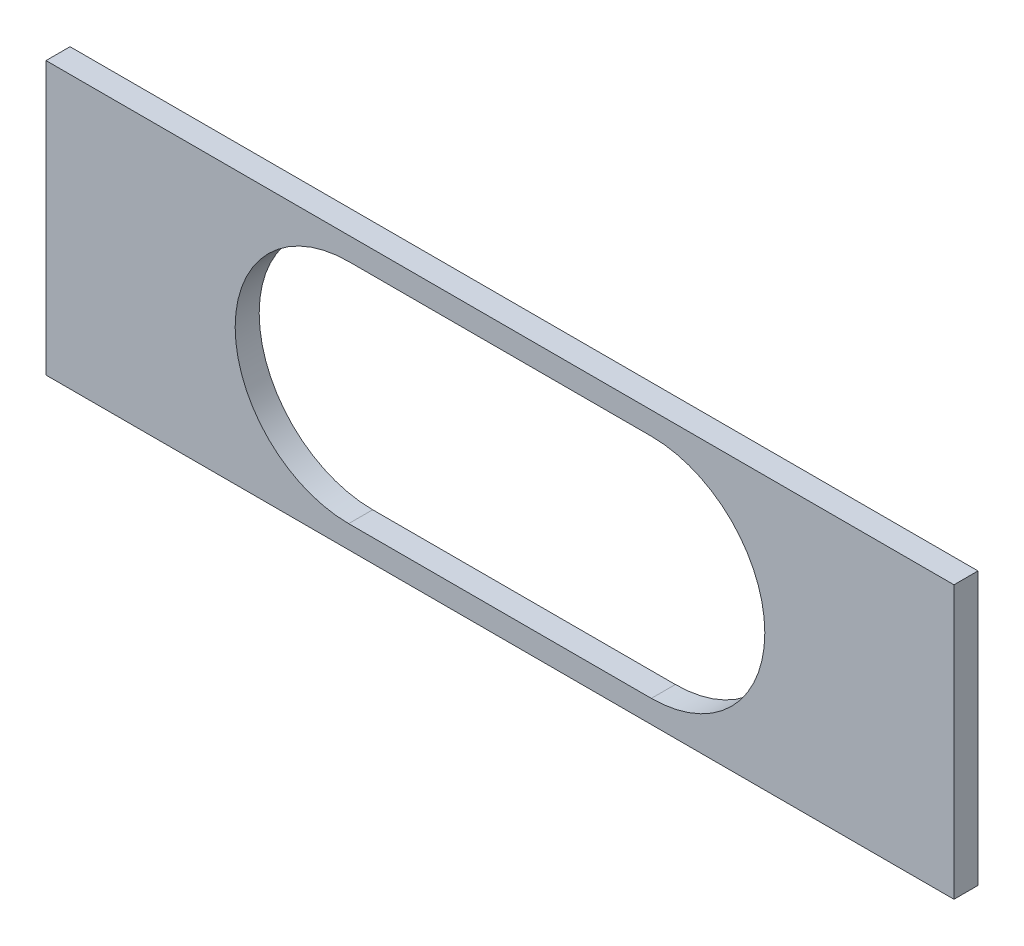
ISO-10303-21;
HEADER;
FILE_DESCRIPTION(('STEP AP214'),'2;1');
FILE_NAME('part.step','',(''),(''),'','','');
FILE_SCHEMA(('AUTOMOTIVE_DESIGN { 1 0 10303 214 1 1 1 1 }'));
ENDSEC;
DATA;
#1=APPLICATION_CONTEXT('core data for automotive mechanical design processes');
#2=APPLICATION_PROTOCOL_DEFINITION('international standard','automotive_design',2000,#1);
#3=PRODUCT_CONTEXT('',#1,'mechanical');
#4=PRODUCT('Part','Part','',(#3));
#5=PRODUCT_RELATED_PRODUCT_CATEGORY('part','',(#4));
#6=PRODUCT_DEFINITION_FORMATION('','',#4);
#7=PRODUCT_DEFINITION_CONTEXT('part definition',#1,'design');
#8=PRODUCT_DEFINITION('design','',#6,#7);
#9=PRODUCT_DEFINITION_SHAPE('','',#8);
#10=(LENGTH_UNIT() NAMED_UNIT(*) SI_UNIT(.MILLI.,.METRE.));
#11=(NAMED_UNIT(*) PLANE_ANGLE_UNIT() SI_UNIT($,.RADIAN.));
#12=(NAMED_UNIT(*) SI_UNIT($,.STERADIAN.) SOLID_ANGLE_UNIT());
#13=UNCERTAINTY_MEASURE_WITH_UNIT(LENGTH_MEASURE(1.E-05),#10,'distance_accuracy_value','');
#14=(GEOMETRIC_REPRESENTATION_CONTEXT(3) GLOBAL_UNCERTAINTY_ASSIGNED_CONTEXT((#13)) GLOBAL_UNIT_ASSIGNED_CONTEXT((#10,
#11,#12)) REPRESENTATION_CONTEXT('',''));
#15=CARTESIAN_POINT('',(0.,0.,0.));
#16=DIRECTION('',(0.,0.,1.));
#17=DIRECTION('',(1.,0.,0.));
#18=AXIS2_PLACEMENT_3D('',#15,#16,#17);
#19=CARTESIAN_POINT('',(-60.,-18.,3.175));
#20=DIRECTION('',(1.,0.,0.));
#21=DIRECTION('',(0.,0.,-1.));
#22=AXIS2_PLACEMENT_3D('',#19,#20,#21);
#23=PLANE('',#22);
#24=DIRECTION('',(0.,-1.,0.));
#25=VECTOR('',#24,1.);
#26=CARTESIAN_POINT('',(-60.,-18.,0.));
#27=LINE('',#26,#25);
#28=CARTESIAN_POINT('',(-60.,18.,0.));
#29=VERTEX_POINT('',#28);
#30=CARTESIAN_POINT('',(-60.,-18.,0.));
#31=VERTEX_POINT('',#30);
#32=EDGE_CURVE('E140',#29,#31,#27,.T.);
#33=ORIENTED_EDGE('',*,*,#32,.T.);
#34=DIRECTION('',(0.,0.,-1.));
#35=VECTOR('',#34,1.);
#36=CARTESIAN_POINT('',(-60.,-18.,3.175));
#37=LINE('',#36,#35);
#38=CARTESIAN_POINT('',(-60.,-18.,3.175));
#39=VERTEX_POINT('',#38);
#40=EDGE_CURVE('E11',#39,#31,#37,.T.);
#41=ORIENTED_EDGE('',*,*,#40,.F.);
#42=DIRECTION('',(0.,-1.,0.));
#43=VECTOR('',#42,1.);
#44=CARTESIAN_POINT('',(-60.,-18.,3.175));
#45=LINE('',#44,#43);
#46=CARTESIAN_POINT('',(-60.,18.,3.175));
#47=VERTEX_POINT('',#46);
#48=EDGE_CURVE('E144',#47,#39,#45,.T.);
#49=ORIENTED_EDGE('',*,*,#48,.F.);
#50=DIRECTION('',(0.,0.,-1.));
#51=VECTOR('',#50,1.);
#52=CARTESIAN_POINT('',(-60.,18.,3.175));
#53=LINE('',#52,#51);
#54=EDGE_CURVE('E154',#47,#29,#53,.T.);
#55=ORIENTED_EDGE('',*,*,#54,.T.);
#56=EDGE_LOOP('',(#33,#41,#49,#55));
#57=FACE_BOUND('',#56,.T.);
#58=ADVANCED_FACE('F39',(#57),#23,.F.);
#59=CARTESIAN_POINT('',(60.,-18.,3.175));
#60=DIRECTION('',(0.,1.,0.));
#61=DIRECTION('',(-1.,0.,0.));
#62=AXIS2_PLACEMENT_3D('',#59,#60,#61);
#63=PLANE('',#62);
#64=DIRECTION('',(1.,0.,0.));
#65=VECTOR('',#64,1.);
#66=CARTESIAN_POINT('',(60.,-18.,0.));
#67=LINE('',#66,#65);
#68=CARTESIAN_POINT('',(60.,-18.,0.));
#69=VERTEX_POINT('',#68);
#70=EDGE_CURVE('E157',#31,#69,#67,.T.);
#71=ORIENTED_EDGE('',*,*,#70,.T.);
#72=DIRECTION('',(0.,0.,-1.));
#73=VECTOR('',#72,1.);
#74=CARTESIAN_POINT('',(60.,-18.,3.175));
#75=LINE('',#74,#73);
#76=CARTESIAN_POINT('',(60.,-18.,3.175));
#77=VERTEX_POINT('',#76);
#78=EDGE_CURVE('E46',#77,#69,#75,.T.);
#79=ORIENTED_EDGE('',*,*,#78,.F.);
#80=DIRECTION('',(1.,0.,0.));
#81=VECTOR('',#80,1.);
#82=CARTESIAN_POINT('',(60.,-18.,3.175));
#83=LINE('',#82,#81);
#84=EDGE_CURVE('E147',#39,#77,#83,.T.);
#85=ORIENTED_EDGE('',*,*,#84,.F.);
#86=ORIENTED_EDGE('',*,*,#40,.T.);
#87=EDGE_LOOP('',(#71,#79,#85,#86));
#88=FACE_BOUND('',#87,.T.);
#89=ADVANCED_FACE('F185',(#88),#63,.F.);
#90=CARTESIAN_POINT('',(60.,-18.,3.175));
#91=DIRECTION('',(-1.,0.,0.));
#92=DIRECTION('',(0.,0.,1.));
#93=AXIS2_PLACEMENT_3D('',#90,#91,#92);
#94=PLANE('',#93);
#95=DIRECTION('',(0.,1.,0.));
#96=VECTOR('',#95,1.);
#97=CARTESIAN_POINT('',(60.,-18.,0.));
#98=LINE('',#97,#96);
#99=CARTESIAN_POINT('',(60.,18.,0.));
#100=VERTEX_POINT('',#99);
#101=EDGE_CURVE('E159',#69,#100,#98,.T.);
#102=ORIENTED_EDGE('',*,*,#101,.T.);
#103=DIRECTION('',(0.,0.,-1.));
#104=VECTOR('',#103,1.);
#105=CARTESIAN_POINT('',(60.,18.,3.175));
#106=LINE('',#105,#104);
#107=CARTESIAN_POINT('',(60.,18.,3.175));
#108=VERTEX_POINT('',#107);
#109=EDGE_CURVE('E164',#108,#100,#106,.T.);
#110=ORIENTED_EDGE('',*,*,#109,.F.);
#111=DIRECTION('',(0.,1.,0.));
#112=VECTOR('',#111,1.);
#113=CARTESIAN_POINT('',(60.,-18.,3.175));
#114=LINE('',#113,#112);
#115=EDGE_CURVE('E150',#77,#108,#114,.T.);
#116=ORIENTED_EDGE('',*,*,#115,.F.);
#117=ORIENTED_EDGE('',*,*,#78,.T.);
#118=EDGE_LOOP('',(#102,#110,#116,#117));
#119=FACE_BOUND('',#118,.T.);
#120=ADVANCED_FACE('F171',(#119),#94,.F.);
#121=CARTESIAN_POINT('',(60.,18.,3.175));
#122=DIRECTION('',(0.,-1.,0.));
#123=DIRECTION('',(1.,0.,0.));
#124=AXIS2_PLACEMENT_3D('',#121,#122,#123);
#125=PLANE('',#124);
#126=DIRECTION('',(-1.,0.,0.));
#127=VECTOR('',#126,1.);
#128=CARTESIAN_POINT('',(60.,18.,0.));
#129=LINE('',#128,#127);
#130=EDGE_CURVE('E148',#100,#29,#129,.T.);
#131=ORIENTED_EDGE('',*,*,#130,.T.);
#132=ORIENTED_EDGE('',*,*,#54,.F.);
#133=DIRECTION('',(-1.,0.,0.));
#134=VECTOR('',#133,1.);
#135=CARTESIAN_POINT('',(60.,18.,3.175));
#136=LINE('',#135,#134);
#137=EDGE_CURVE('E152',#108,#47,#136,.T.);
#138=ORIENTED_EDGE('',*,*,#137,.F.);
#139=ORIENTED_EDGE('',*,*,#109,.T.);
#140=EDGE_LOOP('',(#131,#132,#138,#139));
#141=FACE_BOUND('',#140,.T.);
#142=ADVANCED_FACE('F178',(#141),#125,.F.);
#143=CARTESIAN_POINT('',(0.,0.,3.175));
#144=DIRECTION('',(0.,0.,1.));
#145=DIRECTION('',(1.,0.,0.));
#146=AXIS2_PLACEMENT_3D('',#143,#144,#145);
#147=PLANE('',#146);
#148=CARTESIAN_POINT('',(20.,0.,3.175));
#149=DIRECTION('',(0.,0.,1.));
#150=DIRECTION('',(1.,0.,0.));
#151=AXIS2_PLACEMENT_3D('',#148,#149,#150);
#152=CIRCLE('',#151,15.);
#153=CARTESIAN_POINT('',(20.,-15.,3.175));
#154=VERTEX_POINT('',#153);
#155=CARTESIAN_POINT('',(20.,15.,3.175));
#156=VERTEX_POINT('',#155);
#157=EDGE_CURVE('E53',#154,#156,#152,.T.);
#158=ORIENTED_EDGE('',*,*,#157,.F.);
#159=DIRECTION('',(1.,0.,0.));
#160=VECTOR('',#159,1.);
#161=CARTESIAN_POINT('',(20.,-15.,3.175));
#162=LINE('',#161,#160);
#163=CARTESIAN_POINT('',(-20.,-15.,3.175));
#164=VERTEX_POINT('',#163);
#165=EDGE_CURVE('E121',#164,#154,#162,.T.);
#166=ORIENTED_EDGE('',*,*,#165,.F.);
#167=CARTESIAN_POINT('',(-20.,0.,3.175));
#168=DIRECTION('',(0.,0.,1.));
#169=DIRECTION('',(1.,0.,0.));
#170=AXIS2_PLACEMENT_3D('',#167,#168,#169);
#171=CIRCLE('',#170,15.);
#172=CARTESIAN_POINT('',(-20.,15.,3.175));
#173=VERTEX_POINT('',#172);
#174=EDGE_CURVE('E124',#173,#164,#171,.T.);
#175=ORIENTED_EDGE('',*,*,#174,.F.);
#176=DIRECTION('',(-1.,0.,0.));
#177=VECTOR('',#176,1.);
#178=CARTESIAN_POINT('',(20.,15.,3.175));
#179=LINE('',#178,#177);
#180=EDGE_CURVE('E133',#156,#173,#179,.T.);
#181=ORIENTED_EDGE('',*,*,#180,.F.);
#182=EDGE_LOOP('',(#158,#166,#175,#181));
#183=FACE_BOUND('',#182,.T.);
#184=ORIENTED_EDGE('',*,*,#48,.T.);
#185=ORIENTED_EDGE('',*,*,#84,.T.);
#186=ORIENTED_EDGE('',*,*,#115,.T.);
#187=ORIENTED_EDGE('',*,*,#137,.T.);
#188=EDGE_LOOP('',(#184,#185,#186,#187));
#189=FACE_BOUND('',#188,.T.);
#190=ADVANCED_FACE('F184',(#183,#189),#147,.T.);
#191=CARTESIAN_POINT('',(0.,0.,0.));
#192=DIRECTION('',(0.,0.,1.));
#193=DIRECTION('',(1.,0.,0.));
#194=AXIS2_PLACEMENT_3D('',#191,#192,#193);
#195=PLANE('',#194);
#196=CARTESIAN_POINT('',(-50.,10.,0.));
#197=DIRECTION('',(0.,0.,-1.));
#198=DIRECTION('',(-1.,0.,0.));
#199=AXIS2_PLACEMENT_3D('',#196,#197,#198);
#200=CIRCLE('',#199,0.999999999999998);
#201=CARTESIAN_POINT('',(-51.,10.,0.));
#202=VERTEX_POINT('',#201);
#203=EDGE_CURVE('E263',#202,#202,#200,.T.);
#204=ORIENTED_EDGE('',*,*,#203,.F.);
#205=EDGE_LOOP('',(#204));
#206=FACE_BOUND('',#205,.T.);
#207=CARTESIAN_POINT('',(-50.,-9.99999999999999,0.));
#208=DIRECTION('',(0.,0.,-1.));
#209=DIRECTION('',(-1.,0.,0.));
#210=AXIS2_PLACEMENT_3D('',#207,#208,#209);
#211=CIRCLE('',#210,0.999999999999998);
#212=CARTESIAN_POINT('',(-51.,-9.99999999999999,0.));
#213=VERTEX_POINT('',#212);
#214=EDGE_CURVE('E255',#213,#213,#211,.T.);
#215=ORIENTED_EDGE('',*,*,#214,.F.);
#216=EDGE_LOOP('',(#215));
#217=FACE_BOUND('',#216,.T.);
#218=CARTESIAN_POINT('',(50.,-10.,0.));
#219=DIRECTION('',(0.,0.,-1.));
#220=DIRECTION('',(-1.,0.,0.));
#221=AXIS2_PLACEMENT_3D('',#218,#219,#220);
#222=CIRCLE('',#221,0.999999999999998);
#223=CARTESIAN_POINT('',(49.,-10.,0.));
#224=VERTEX_POINT('',#223);
#225=EDGE_CURVE('E251',#224,#224,#222,.T.);
#226=ORIENTED_EDGE('',*,*,#225,.F.);
#227=EDGE_LOOP('',(#226));
#228=FACE_BOUND('',#227,.T.);
#229=CARTESIAN_POINT('',(50.,9.99999999999999,0.));
#230=DIRECTION('',(0.,0.,-1.));
#231=DIRECTION('',(-1.,0.,0.));
#232=AXIS2_PLACEMENT_3D('',#229,#230,#231);
#233=CIRCLE('',#232,0.999999999999998);
#234=CARTESIAN_POINT('',(49.,9.99999999999999,0.));
#235=VERTEX_POINT('',#234);
#236=EDGE_CURVE('E127',#235,#235,#233,.T.);
#237=ORIENTED_EDGE('',*,*,#236,.F.);
#238=EDGE_LOOP('',(#237));
#239=FACE_BOUND('',#238,.T.);
#240=DIRECTION('',(1.,0.,0.));
#241=VECTOR('',#240,1.);
#242=CARTESIAN_POINT('',(20.,-15.,0.));
#243=LINE('',#242,#241);
#244=CARTESIAN_POINT('',(-20.,-15.,0.));
#245=VERTEX_POINT('',#244);
#246=CARTESIAN_POINT('',(20.,-15.,0.));
#247=VERTEX_POINT('',#246);
#248=EDGE_CURVE('E111',#245,#247,#243,.T.);
#249=ORIENTED_EDGE('',*,*,#248,.T.);
#250=CARTESIAN_POINT('',(20.,0.,0.));
#251=DIRECTION('',(0.,0.,1.));
#252=DIRECTION('',(1.,0.,0.));
#253=AXIS2_PLACEMENT_3D('',#250,#251,#252);
#254=CIRCLE('',#253,15.);
#255=CARTESIAN_POINT('',(20.,15.,0.));
#256=VERTEX_POINT('',#255);
#257=EDGE_CURVE('E105',#247,#256,#254,.T.);
#258=ORIENTED_EDGE('',*,*,#257,.T.);
#259=DIRECTION('',(-1.,0.,0.));
#260=VECTOR('',#259,1.);
#261=CARTESIAN_POINT('',(20.,15.,0.));
#262=LINE('',#261,#260);
#263=CARTESIAN_POINT('',(-20.,15.,0.));
#264=VERTEX_POINT('',#263);
#265=EDGE_CURVE('E114',#256,#264,#262,.T.);
#266=ORIENTED_EDGE('',*,*,#265,.T.);
#267=CARTESIAN_POINT('',(-20.,0.,0.));
#268=DIRECTION('',(0.,0.,1.));
#269=DIRECTION('',(1.,0.,0.));
#270=AXIS2_PLACEMENT_3D('',#267,#268,#269);
#271=CIRCLE('',#270,15.);
#272=EDGE_CURVE('E61',#264,#245,#271,.T.);
#273=ORIENTED_EDGE('',*,*,#272,.T.);
#274=EDGE_LOOP('',(#249,#258,#266,#273));
#275=FACE_BOUND('',#274,.T.);
#276=ORIENTED_EDGE('',*,*,#32,.F.);
#277=ORIENTED_EDGE('',*,*,#130,.F.);
#278=ORIENTED_EDGE('',*,*,#101,.F.);
#279=ORIENTED_EDGE('',*,*,#70,.F.);
#280=EDGE_LOOP('',(#276,#277,#278,#279));
#281=FACE_BOUND('',#280,.T.);
#282=ADVANCED_FACE('F118',(#206,#217,#228,#239,#275,#281),#195,.F.);
#283=CARTESIAN_POINT('',(20.,0.,0.));
#284=DIRECTION('',(0.,0.,1.));
#285=DIRECTION('',(1.,0.,0.));
#286=AXIS2_PLACEMENT_3D('',#283,#284,#285);
#287=CYLINDRICAL_SURFACE('',#286,15.);
#288=ORIENTED_EDGE('',*,*,#157,.T.);
#289=DIRECTION('',(0.,0.,1.));
#290=VECTOR('',#289,1.);
#291=CARTESIAN_POINT('',(20.,15.,0.));
#292=LINE('',#291,#290);
#293=EDGE_CURVE('E101',#256,#156,#292,.T.);
#294=ORIENTED_EDGE('',*,*,#293,.F.);
#295=ORIENTED_EDGE('',*,*,#257,.F.);
#296=DIRECTION('',(0.,0.,1.));
#297=VECTOR('',#296,1.);
#298=CARTESIAN_POINT('',(20.,-15.,0.));
#299=LINE('',#298,#297);
#300=EDGE_CURVE('E138',#247,#154,#299,.T.);
#301=ORIENTED_EDGE('',*,*,#300,.T.);
#302=EDGE_LOOP('',(#288,#294,#295,#301));
#303=FACE_BOUND('',#302,.T.);
#304=ADVANCED_FACE('F103',(#303),#287,.F.);
#305=CARTESIAN_POINT('',(20.,-15.,0.));
#306=DIRECTION('',(0.,-1.,0.));
#307=DIRECTION('',(1.,0.,0.));
#308=AXIS2_PLACEMENT_3D('',#305,#306,#307);
#309=PLANE('',#308);
#310=ORIENTED_EDGE('',*,*,#165,.T.);
#311=ORIENTED_EDGE('',*,*,#300,.F.);
#312=ORIENTED_EDGE('',*,*,#248,.F.);
#313=DIRECTION('',(0.,0.,1.));
#314=VECTOR('',#313,1.);
#315=CARTESIAN_POINT('',(-20.,-15.,0.));
#316=LINE('',#315,#314);
#317=EDGE_CURVE('E141',#245,#164,#316,.T.);
#318=ORIENTED_EDGE('',*,*,#317,.T.);
#319=EDGE_LOOP('',(#310,#311,#312,#318));
#320=FACE_BOUND('',#319,.T.);
#321=ADVANCED_FACE('F203',(#320),#309,.F.);
#322=CARTESIAN_POINT('',(-20.,0.,0.));
#323=DIRECTION('',(0.,0.,1.));
#324=DIRECTION('',(1.,0.,0.));
#325=AXIS2_PLACEMENT_3D('',#322,#323,#324);
#326=CYLINDRICAL_SURFACE('',#325,15.);
#327=ORIENTED_EDGE('',*,*,#174,.T.);
#328=ORIENTED_EDGE('',*,*,#317,.F.);
#329=ORIENTED_EDGE('',*,*,#272,.F.);
#330=DIRECTION('',(0.,0.,1.));
#331=VECTOR('',#330,1.);
#332=CARTESIAN_POINT('',(-20.,15.,0.));
#333=LINE('',#332,#331);
#334=EDGE_CURVE('E110',#264,#173,#333,.T.);
#335=ORIENTED_EDGE('',*,*,#334,.T.);
#336=EDGE_LOOP('',(#327,#328,#329,#335));
#337=FACE_BOUND('',#336,.T.);
#338=ADVANCED_FACE('F207',(#337),#326,.F.);
#339=CARTESIAN_POINT('',(20.,15.,0.));
#340=DIRECTION('',(0.,1.,0.));
#341=DIRECTION('',(-1.,0.,0.));
#342=AXIS2_PLACEMENT_3D('',#339,#340,#341);
#343=PLANE('',#342);
#344=ORIENTED_EDGE('',*,*,#180,.T.);
#345=ORIENTED_EDGE('',*,*,#334,.F.);
#346=ORIENTED_EDGE('',*,*,#265,.F.);
#347=ORIENTED_EDGE('',*,*,#293,.T.);
#348=EDGE_LOOP('',(#344,#345,#346,#347));
#349=FACE_BOUND('',#348,.T.);
#350=ADVANCED_FACE('F115',(#349),#343,.F.);
#351=CARTESIAN_POINT('',(50.,9.99999999999999,0.5));
#352=DIRECTION('',(0.,0.,-1.));
#353=DIRECTION('',(-1.,0.,0.));
#354=AXIS2_PLACEMENT_3D('',#351,#352,#353);
#355=CYLINDRICAL_SURFACE('',#354,0.999999999999998);
#356=CARTESIAN_POINT('',(50.,9.99999999999999,0.5));
#357=DIRECTION('',(0.,0.,-1.));
#358=DIRECTION('',(-1.,0.,0.));
#359=AXIS2_PLACEMENT_3D('',#356,#357,#358);
#360=CIRCLE('',#359,0.999999999999998);
#361=CARTESIAN_POINT('',(49.,9.99999999999999,0.5));
#362=VERTEX_POINT('',#361);
#363=EDGE_CURVE('E134',#362,#362,#360,.T.);
#364=ORIENTED_EDGE('',*,*,#363,.F.);
#365=EDGE_LOOP('',(#364));
#366=FACE_BOUND('',#365,.T.);
#367=ORIENTED_EDGE('',*,*,#236,.T.);
#368=EDGE_LOOP('',(#367));
#369=FACE_BOUND('',#368,.T.);
#370=ADVANCED_FACE('F206',(#366,#369),#355,.F.);
#371=CARTESIAN_POINT('',(50.,9.99999999999999,0.5));
#372=DIRECTION('',(0.,0.,-1.));
#373=DIRECTION('',(-1.,0.,0.));
#374=AXIS2_PLACEMENT_3D('',#371,#372,#373);
#375=PLANE('',#374);
#376=ORIENTED_EDGE('',*,*,#363,.T.);
#377=EDGE_LOOP('',(#376));
#378=FACE_BOUND('',#377,.T.);
#379=ADVANCED_FACE('F215',(#378),#375,.T.);
#380=CARTESIAN_POINT('',(50.,-10.,0.5));
#381=DIRECTION('',(0.,0.,-1.));
#382=DIRECTION('',(-1.,0.,0.));
#383=AXIS2_PLACEMENT_3D('',#380,#381,#382);
#384=CYLINDRICAL_SURFACE('',#383,0.999999999999998);
#385=CARTESIAN_POINT('',(50.,-10.,0.5));
#386=DIRECTION('',(0.,0.,-1.));
#387=DIRECTION('',(-1.,0.,0.));
#388=AXIS2_PLACEMENT_3D('',#385,#386,#387);
#389=CIRCLE('',#388,0.999999999999998);
#390=CARTESIAN_POINT('',(49.,-10.,0.5));
#391=VERTEX_POINT('',#390);
#392=EDGE_CURVE('E248',#391,#391,#389,.T.);
#393=ORIENTED_EDGE('',*,*,#392,.F.);
#394=EDGE_LOOP('',(#393));
#395=FACE_BOUND('',#394,.T.);
#396=ORIENTED_EDGE('',*,*,#225,.T.);
#397=EDGE_LOOP('',(#396));
#398=FACE_BOUND('',#397,.T.);
#399=ADVANCED_FACE('F219',(#395,#398),#384,.F.);
#400=CARTESIAN_POINT('',(50.,-10.,0.5));
#401=DIRECTION('',(0.,0.,-1.));
#402=DIRECTION('',(-1.,0.,0.));
#403=AXIS2_PLACEMENT_3D('',#400,#401,#402);
#404=PLANE('',#403);
#405=ORIENTED_EDGE('',*,*,#392,.T.);
#406=EDGE_LOOP('',(#405));
#407=FACE_BOUND('',#406,.T.);
#408=ADVANCED_FACE('F236',(#407),#404,.T.);
#409=CARTESIAN_POINT('',(-50.,-9.99999999999999,0.5));
#410=DIRECTION('',(0.,0.,-1.));
#411=DIRECTION('',(-1.,0.,0.));
#412=AXIS2_PLACEMENT_3D('',#409,#410,#411);
#413=CYLINDRICAL_SURFACE('',#412,0.999999999999998);
#414=CARTESIAN_POINT('',(-50.,-9.99999999999999,0.5));
#415=DIRECTION('',(0.,0.,-1.));
#416=DIRECTION('',(-1.,0.,0.));
#417=AXIS2_PLACEMENT_3D('',#414,#415,#416);
#418=CIRCLE('',#417,0.999999999999998);
#419=CARTESIAN_POINT('',(-51.,-9.99999999999999,0.5));
#420=VERTEX_POINT('',#419);
#421=EDGE_CURVE('E260',#420,#420,#418,.T.);
#422=ORIENTED_EDGE('',*,*,#421,.F.);
#423=EDGE_LOOP('',(#422));
#424=FACE_BOUND('',#423,.T.);
#425=ORIENTED_EDGE('',*,*,#214,.T.);
#426=EDGE_LOOP('',(#425));
#427=FACE_BOUND('',#426,.T.);
#428=ADVANCED_FACE('F232',(#424,#427),#413,.F.);
#429=CARTESIAN_POINT('',(-50.,-9.99999999999999,0.5));
#430=DIRECTION('',(0.,0.,-1.));
#431=DIRECTION('',(-1.,0.,0.));
#432=AXIS2_PLACEMENT_3D('',#429,#430,#431);
#433=PLANE('',#432);
#434=ORIENTED_EDGE('',*,*,#421,.T.);
#435=EDGE_LOOP('',(#434));
#436=FACE_BOUND('',#435,.T.);
#437=ADVANCED_FACE('F228',(#436),#433,.T.);
#438=CARTESIAN_POINT('',(-50.,10.,0.5));
#439=DIRECTION('',(0.,0.,-1.));
#440=DIRECTION('',(-1.,0.,0.));
#441=AXIS2_PLACEMENT_3D('',#438,#439,#440);
#442=CYLINDRICAL_SURFACE('',#441,0.999999999999998);
#443=CARTESIAN_POINT('',(-50.,10.,0.5));
#444=DIRECTION('',(0.,0.,-1.));
#445=DIRECTION('',(-1.,0.,0.));
#446=AXIS2_PLACEMENT_3D('',#443,#444,#445);
#447=CIRCLE('',#446,0.999999999999998);
#448=CARTESIAN_POINT('',(-51.,10.,0.5));
#449=VERTEX_POINT('',#448);
#450=EDGE_CURVE('E266',#449,#449,#447,.T.);
#451=ORIENTED_EDGE('',*,*,#450,.F.);
#452=EDGE_LOOP('',(#451));
#453=FACE_BOUND('',#452,.T.);
#454=ORIENTED_EDGE('',*,*,#203,.T.);
#455=EDGE_LOOP('',(#454));
#456=FACE_BOUND('',#455,.T.);
#457=ADVANCED_FACE('F224',(#453,#456),#442,.F.);
#458=CARTESIAN_POINT('',(-50.,10.,0.5));
#459=DIRECTION('',(0.,0.,-1.));
#460=DIRECTION('',(-1.,0.,0.));
#461=AXIS2_PLACEMENT_3D('',#458,#459,#460);
#462=PLANE('',#461);
#463=ORIENTED_EDGE('',*,*,#450,.T.);
#464=EDGE_LOOP('',(#463));
#465=FACE_BOUND('',#464,.T.);
#466=ADVANCED_FACE('F221',(#465),#462,.T.);
#467=CLOSED_SHELL('',(#58,#89,#120,#142,#190,#282,#304,#321,#338,#350,#370,#379,#399,#408,#428,
#437,#457,#466));
#468=MANIFOLD_SOLID_BREP('B2',#467);
#469=ADVANCED_BREP_SHAPE_REPRESENTATION('',(#18,#468),#14);
#470=SHAPE_DEFINITION_REPRESENTATION(#9,#469);
ENDSEC;
END-ISO-10303-21;
